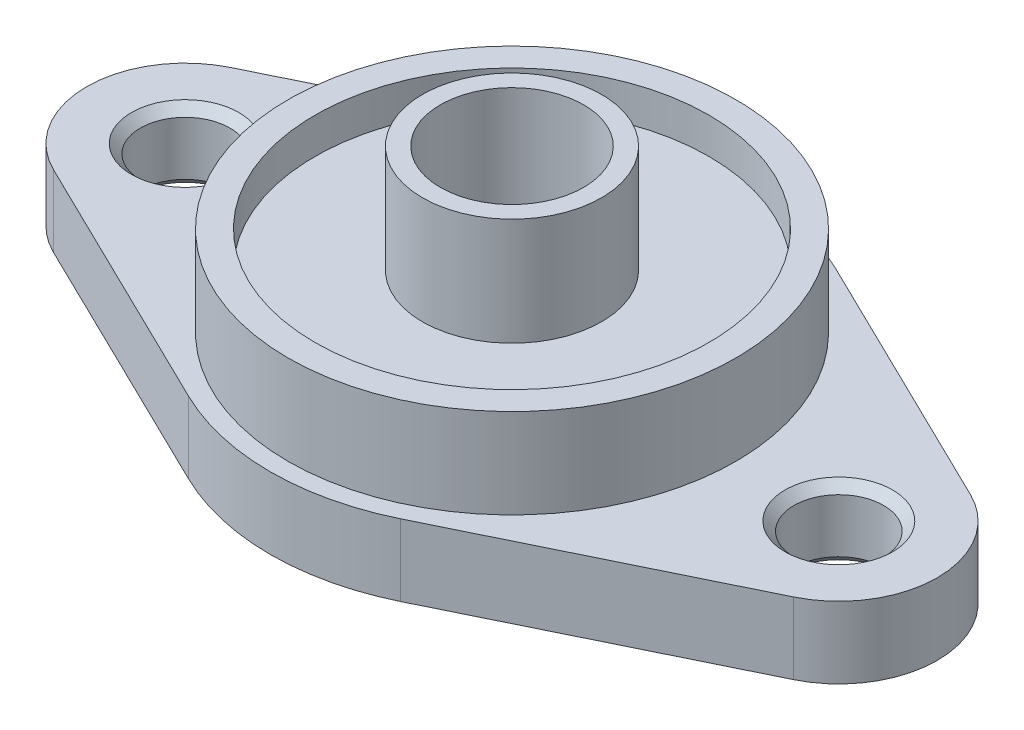
ISO-10303-21;
HEADER;
FILE_DESCRIPTION(('STEP AP214'),'2;1');
FILE_NAME('part.step','',(''),(''),'','','');
FILE_SCHEMA(('AUTOMOTIVE_DESIGN { 1 0 10303 214 1 1 1 1 }'));
ENDSEC;
DATA;
#1=APPLICATION_CONTEXT('core data for automotive mechanical design processes');
#2=APPLICATION_PROTOCOL_DEFINITION('international standard','automotive_design',2000,#1);
#3=PRODUCT_CONTEXT('',#1,'mechanical');
#4=PRODUCT('Part','Part','',(#3));
#5=PRODUCT_RELATED_PRODUCT_CATEGORY('part','',(#4));
#6=PRODUCT_DEFINITION_FORMATION('','',#4);
#7=PRODUCT_DEFINITION_CONTEXT('part definition',#1,'design');
#8=PRODUCT_DEFINITION('design','',#6,#7);
#9=PRODUCT_DEFINITION_SHAPE('','',#8);
#10=(LENGTH_UNIT() NAMED_UNIT(*) SI_UNIT(.MILLI.,.METRE.));
#11=(NAMED_UNIT(*) PLANE_ANGLE_UNIT() SI_UNIT($,.RADIAN.));
#12=(NAMED_UNIT(*) SI_UNIT($,.STERADIAN.) SOLID_ANGLE_UNIT());
#13=UNCERTAINTY_MEASURE_WITH_UNIT(LENGTH_MEASURE(1.E-05),#10,'distance_accuracy_value','');
#14=(GEOMETRIC_REPRESENTATION_CONTEXT(3) GLOBAL_UNCERTAINTY_ASSIGNED_CONTEXT((#13)) GLOBAL_UNIT_ASSIGNED_CONTEXT((#10,
#11,#12)) REPRESENTATION_CONTEXT('',''));
#15=CARTESIAN_POINT('',(0.,0.,0.));
#16=DIRECTION('',(0.,0.,1.));
#17=DIRECTION('',(1.,0.,0.));
#18=AXIS2_PLACEMENT_3D('',#15,#16,#17);
#19=CARTESIAN_POINT('',(0.,4.,0.));
#20=DIRECTION('',(0.,1.,0.));
#21=DIRECTION('',(0.,0.,1.));
#22=AXIS2_PLACEMENT_3D('',#19,#20,#21);
#23=PLANE('',#22);
#24=CARTESIAN_POINT('',(18.25,4.,0.));
#25=DIRECTION('',(0.,1.,0.));
#26=DIRECTION('',(0.,0.,1.));
#27=AXIS2_PLACEMENT_3D('',#24,#25,#26);
#28=CIRCLE('',#27,3.);
#29=CARTESIAN_POINT('',(18.25,4.,3.));
#30=VERTEX_POINT('',#29);
#31=EDGE_CURVE('E181',#30,#30,#28,.F.);
#32=ORIENTED_EDGE('',*,*,#31,.T.);
#33=EDGE_LOOP('',(#32));
#34=FACE_BOUND('',#33,.T.);
#35=CARTESIAN_POINT('',(-18.25,4.,0.));
#36=DIRECTION('',(0.,1.,0.));
#37=DIRECTION('',(0.,0.,1.));
#38=AXIS2_PLACEMENT_3D('',#35,#36,#37);
#39=CIRCLE('',#38,3.);
#40=CARTESIAN_POINT('',(-18.25,4.,3.));
#41=VERTEX_POINT('',#40);
#42=EDGE_CURVE('E178',#41,#41,#39,.F.);
#43=ORIENTED_EDGE('',*,*,#42,.T.);
#44=EDGE_LOOP('',(#43));
#45=FACE_BOUND('',#44,.T.);
#46=CARTESIAN_POINT('',(0.,4.,0.));
#47=DIRECTION('',(0.,1.,0.));
#48=DIRECTION('',(0.,0.,1.));
#49=AXIS2_PLACEMENT_3D('',#46,#47,#48);
#50=CIRCLE('',#49,13.5);
#51=CARTESIAN_POINT('',(5.91780821917808,4.,-12.1338182729522));
#52=VERTEX_POINT('',#51);
#53=CARTESIAN_POINT('',(-5.91780821917808,4.,-12.1338182729522));
#54=VERTEX_POINT('',#53);
#55=EDGE_CURVE('E148',#52,#54,#50,.T.);
#56=ORIENTED_EDGE('',*,*,#55,.T.);
#57=DIRECTION('',(-0.898801353552014,0.,0.438356164383562));
#58=VECTOR('',#57,1.);
#59=CARTESIAN_POINT('',(-5.91780821917808,4.,-12.1338182729522));
#60=LINE('',#59,#58);
#61=CARTESIAN_POINT('',(-20.6609589041096,4.,-4.94340744453608));
#62=VERTEX_POINT('',#61);
#63=EDGE_CURVE('E96',#54,#62,#60,.T.);
#64=ORIENTED_EDGE('',*,*,#63,.T.);
#65=CARTESIAN_POINT('',(-18.25,4.,0.));
#66=DIRECTION('',(0.,1.,0.));
#67=DIRECTION('',(0.,0.,1.));
#68=AXIS2_PLACEMENT_3D('',#65,#66,#67);
#69=CIRCLE('',#68,5.5);
#70=CARTESIAN_POINT('',(-20.6609589041096,4.,4.94340744453608));
#71=VERTEX_POINT('',#70);
#72=EDGE_CURVE('E309',#62,#71,#69,.T.);
#73=ORIENTED_EDGE('',*,*,#72,.T.);
#74=DIRECTION('',(0.898801353552014,0.,0.438356164383561));
#75=VECTOR('',#74,1.);
#76=CARTESIAN_POINT('',(-5.91780821917808,4.,12.1338182729522));
#77=LINE('',#76,#75);
#78=CARTESIAN_POINT('',(-5.91780821917808,4.,12.1338182729522));
#79=VERTEX_POINT('',#78);
#80=EDGE_CURVE('E311',#71,#79,#77,.T.);
#81=ORIENTED_EDGE('',*,*,#80,.T.);
#82=CARTESIAN_POINT('',(0.,4.,0.));
#83=DIRECTION('',(0.,1.,0.));
#84=DIRECTION('',(0.,0.,1.));
#85=AXIS2_PLACEMENT_3D('',#82,#83,#84);
#86=CIRCLE('',#85,13.5);
#87=CARTESIAN_POINT('',(5.91780821917808,4.,12.1338182729522));
#88=VERTEX_POINT('',#87);
#89=EDGE_CURVE('E115',#79,#88,#86,.T.);
#90=ORIENTED_EDGE('',*,*,#89,.T.);
#91=DIRECTION('',(0.898801353552014,0.,-0.438356164383561));
#92=VECTOR('',#91,1.);
#93=CARTESIAN_POINT('',(5.91780821917808,4.,12.1338182729522));
#94=LINE('',#93,#92);
#95=CARTESIAN_POINT('',(20.6609589041096,4.,4.94340744453608));
#96=VERTEX_POINT('',#95);
#97=EDGE_CURVE('E109',#88,#96,#94,.T.);
#98=ORIENTED_EDGE('',*,*,#97,.T.);
#99=CARTESIAN_POINT('',(18.25,4.,0.));
#100=DIRECTION('',(0.,1.,0.));
#101=DIRECTION('',(0.,0.,1.));
#102=AXIS2_PLACEMENT_3D('',#99,#100,#101);
#103=CIRCLE('',#102,5.5);
#104=CARTESIAN_POINT('',(20.6609589041096,4.,-4.94340744453608));
#105=VERTEX_POINT('',#104);
#106=EDGE_CURVE('E113',#96,#105,#103,.T.);
#107=ORIENTED_EDGE('',*,*,#106,.T.);
#108=DIRECTION('',(-0.898801353552014,0.,-0.438356164383561));
#109=VECTOR('',#108,1.);
#110=CARTESIAN_POINT('',(5.91780821917808,4.,-12.1338182729522));
#111=LINE('',#110,#109);
#112=EDGE_CURVE('E52',#105,#52,#111,.T.);
#113=ORIENTED_EDGE('',*,*,#112,.T.);
#114=EDGE_LOOP('',(#56,#64,#73,#81,#90,#98,#107,#113));
#115=FACE_BOUND('',#114,.T.);
#116=CARTESIAN_POINT('',(0.,4.,0.));
#117=DIRECTION('',(0.,1.,0.));
#118=DIRECTION('',(0.,0.,1.));
#119=AXIS2_PLACEMENT_3D('',#116,#117,#118);
#120=CIRCLE('',#119,12.5);
#121=CARTESIAN_POINT('',(0.,4.,12.5));
#122=VERTEX_POINT('',#121);
#123=EDGE_CURVE('E291',#122,#122,#120,.T.);
#124=ORIENTED_EDGE('',*,*,#123,.F.);
#125=EDGE_LOOP('',(#124));
#126=FACE_BOUND('',#125,.T.);
#127=ADVANCED_FACE('F35',(#34,#45,#115,#126),#23,.T.);
#128=CARTESIAN_POINT('',(0.,0.,0.));
#129=DIRECTION('',(0.,1.,0.));
#130=DIRECTION('',(0.,0.,1.));
#131=AXIS2_PLACEMENT_3D('',#128,#129,#130);
#132=PLANE('',#131);
#133=CARTESIAN_POINT('',(18.25,0.,0.));
#134=DIRECTION('',(0.,1.,0.));
#135=DIRECTION('',(0.,0.,1.));
#136=AXIS2_PLACEMENT_3D('',#133,#134,#135);
#137=CIRCLE('',#136,3.00000000000001);
#138=CARTESIAN_POINT('',(18.25,0.,3.));
#139=VERTEX_POINT('',#138);
#140=EDGE_CURVE('E169',#139,#139,#137,.T.);
#141=ORIENTED_EDGE('',*,*,#140,.T.);
#142=EDGE_LOOP('',(#141));
#143=FACE_BOUND('',#142,.T.);
#144=CARTESIAN_POINT('',(-18.25,0.,0.));
#145=DIRECTION('',(0.,1.,0.));
#146=DIRECTION('',(0.,0.,1.));
#147=AXIS2_PLACEMENT_3D('',#144,#145,#146);
#148=CIRCLE('',#147,3.00000000000001);
#149=CARTESIAN_POINT('',(-18.25,0.,3.00000000000001));
#150=VERTEX_POINT('',#149);
#151=EDGE_CURVE('E166',#150,#150,#148,.T.);
#152=ORIENTED_EDGE('',*,*,#151,.T.);
#153=EDGE_LOOP('',(#152));
#154=FACE_BOUND('',#153,.T.);
#155=CARTESIAN_POINT('',(0.,0.,0.));
#156=DIRECTION('',(0.,1.,0.));
#157=DIRECTION('',(0.,0.,1.));
#158=AXIS2_PLACEMENT_3D('',#155,#156,#157);
#159=CIRCLE('',#158,13.5);
#160=CARTESIAN_POINT('',(5.91780821917808,0.,-12.1338182729522));
#161=VERTEX_POINT('',#160);
#162=CARTESIAN_POINT('',(-5.91780821917808,0.,-12.1338182729522));
#163=VERTEX_POINT('',#162);
#164=EDGE_CURVE('E133',#161,#163,#159,.T.);
#165=ORIENTED_EDGE('',*,*,#164,.F.);
#166=DIRECTION('',(-0.898801353552014,0.,-0.438356164383561));
#167=VECTOR('',#166,1.);
#168=CARTESIAN_POINT('',(5.91780821917808,0.,-12.1338182729522));
#169=LINE('',#168,#167);
#170=CARTESIAN_POINT('',(20.6609589041096,0.,-4.94340744453608));
#171=VERTEX_POINT('',#170);
#172=EDGE_CURVE('E87',#171,#161,#169,.T.);
#173=ORIENTED_EDGE('',*,*,#172,.F.);
#174=CARTESIAN_POINT('',(18.25,0.,0.));
#175=DIRECTION('',(0.,1.,0.));
#176=DIRECTION('',(0.,0.,1.));
#177=AXIS2_PLACEMENT_3D('',#174,#175,#176);
#178=CIRCLE('',#177,5.5);
#179=CARTESIAN_POINT('',(20.6609589041096,0.,4.94340744453608));
#180=VERTEX_POINT('',#179);
#181=EDGE_CURVE('E81',#180,#171,#178,.T.);
#182=ORIENTED_EDGE('',*,*,#181,.F.);
#183=DIRECTION('',(0.898801353552014,0.,-0.438356164383561));
#184=VECTOR('',#183,1.);
#185=CARTESIAN_POINT('',(5.91780821917808,0.,12.1338182729522));
#186=LINE('',#185,#184);
#187=CARTESIAN_POINT('',(5.91780821917808,0.,12.1338182729522));
#188=VERTEX_POINT('',#187);
#189=EDGE_CURVE('E123',#188,#180,#186,.T.);
#190=ORIENTED_EDGE('',*,*,#189,.F.);
#191=CARTESIAN_POINT('',(0.,0.,0.));
#192=DIRECTION('',(0.,1.,0.));
#193=DIRECTION('',(0.,0.,1.));
#194=AXIS2_PLACEMENT_3D('',#191,#192,#193);
#195=CIRCLE('',#194,13.5);
#196=CARTESIAN_POINT('',(-5.91780821917808,0.,12.1338182729522));
#197=VERTEX_POINT('',#196);
#198=EDGE_CURVE('E143',#197,#188,#195,.T.);
#199=ORIENTED_EDGE('',*,*,#198,.F.);
#200=DIRECTION('',(0.898801353552014,0.,0.438356164383561));
#201=VECTOR('',#200,1.);
#202=CARTESIAN_POINT('',(-5.91780821917808,0.,12.1338182729522));
#203=LINE('',#202,#201);
#204=CARTESIAN_POINT('',(-20.6609589041096,0.,4.94340744453608));
#205=VERTEX_POINT('',#204);
#206=EDGE_CURVE('E141',#205,#197,#203,.T.);
#207=ORIENTED_EDGE('',*,*,#206,.F.);
#208=CARTESIAN_POINT('',(-18.25,0.,0.));
#209=DIRECTION('',(0.,1.,0.));
#210=DIRECTION('',(0.,0.,1.));
#211=AXIS2_PLACEMENT_3D('',#208,#209,#210);
#212=CIRCLE('',#211,5.5);
#213=CARTESIAN_POINT('',(-20.6609589041096,0.,-4.94340744453608));
#214=VERTEX_POINT('',#213);
#215=EDGE_CURVE('E139',#214,#205,#212,.T.);
#216=ORIENTED_EDGE('',*,*,#215,.F.);
#217=DIRECTION('',(-0.898801353552014,0.,0.438356164383562));
#218=VECTOR('',#217,1.);
#219=CARTESIAN_POINT('',(-5.91780821917808,0.,-12.1338182729522));
#220=LINE('',#219,#218);
#221=EDGE_CURVE('E136',#163,#214,#220,.T.);
#222=ORIENTED_EDGE('',*,*,#221,.F.);
#223=EDGE_LOOP('',(#165,#173,#182,#190,#199,#207,#216,#222));
#224=FACE_BOUND('',#223,.T.);
#225=CARTESIAN_POINT('',(0.,0.,0.));
#226=DIRECTION('',(0.,1.,0.));
#227=DIRECTION('',(0.,0.,1.));
#228=AXIS2_PLACEMENT_3D('',#225,#226,#227);
#229=CIRCLE('',#228,4.);
#230=CARTESIAN_POINT('',(0.,0.,4.));
#231=VERTEX_POINT('',#230);
#232=EDGE_CURVE('E137',#231,#231,#229,.T.);
#233=ORIENTED_EDGE('',*,*,#232,.T.);
#234=EDGE_LOOP('',(#233));
#235=FACE_BOUND('',#234,.T.);
#236=ADVANCED_FACE('F198',(#143,#154,#224,#235),#132,.F.);
#237=CARTESIAN_POINT('',(0.,4.,0.));
#238=DIRECTION('',(0.,-1.,0.));
#239=DIRECTION('',(0.,0.,-1.));
#240=AXIS2_PLACEMENT_3D('',#237,#238,#239);
#241=CYLINDRICAL_SURFACE('',#240,13.5);
#242=ORIENTED_EDGE('',*,*,#164,.T.);
#243=DIRECTION('',(0.,-1.,0.));
#244=VECTOR('',#243,1.);
#245=CARTESIAN_POINT('',(-5.91780821917808,4.,-12.1338182729522));
#246=LINE('',#245,#244);
#247=EDGE_CURVE('E161',#54,#163,#246,.T.);
#248=ORIENTED_EDGE('',*,*,#247,.F.);
#249=ORIENTED_EDGE('',*,*,#55,.F.);
#250=DIRECTION('',(0.,-1.,0.));
#251=VECTOR('',#250,1.);
#252=CARTESIAN_POINT('',(5.91780821917808,4.,-12.1338182729522));
#253=LINE('',#252,#251);
#254=EDGE_CURVE('E129',#52,#161,#253,.T.);
#255=ORIENTED_EDGE('',*,*,#254,.T.);
#256=EDGE_LOOP('',(#242,#248,#249,#255));
#257=FACE_BOUND('',#256,.T.);
#258=ADVANCED_FACE('F204',(#257),#241,.T.);
#259=CARTESIAN_POINT('',(-5.91780821917808,4.,-12.1338182729522));
#260=DIRECTION('',(0.438356164383562,0.,0.898801353552014));
#261=DIRECTION('',(0.898801353552014,0.,-0.438356164383562));
#262=AXIS2_PLACEMENT_3D('',#259,#260,#261);
#263=PLANE('',#262);
#264=ORIENTED_EDGE('',*,*,#221,.T.);
#265=DIRECTION('',(0.,-1.,0.));
#266=VECTOR('',#265,1.);
#267=CARTESIAN_POINT('',(-20.6609589041096,4.,-4.94340744453608));
#268=LINE('',#267,#266);
#269=EDGE_CURVE('E158',#62,#214,#268,.T.);
#270=ORIENTED_EDGE('',*,*,#269,.F.);
#271=ORIENTED_EDGE('',*,*,#63,.F.);
#272=ORIENTED_EDGE('',*,*,#247,.T.);
#273=EDGE_LOOP('',(#264,#270,#271,#272));
#274=FACE_BOUND('',#273,.T.);
#275=ADVANCED_FACE('F230',(#274),#263,.F.);
#276=CARTESIAN_POINT('',(-18.25,4.,0.));
#277=DIRECTION('',(0.,-1.,0.));
#278=DIRECTION('',(0.,0.,-1.));
#279=AXIS2_PLACEMENT_3D('',#276,#277,#278);
#280=CYLINDRICAL_SURFACE('',#279,5.5);
#281=ORIENTED_EDGE('',*,*,#215,.T.);
#282=DIRECTION('',(0.,-1.,0.));
#283=VECTOR('',#282,1.);
#284=CARTESIAN_POINT('',(-20.6609589041096,4.,4.94340744453608));
#285=LINE('',#284,#283);
#286=EDGE_CURVE('E155',#71,#205,#285,.T.);
#287=ORIENTED_EDGE('',*,*,#286,.F.);
#288=ORIENTED_EDGE('',*,*,#72,.F.);
#289=ORIENTED_EDGE('',*,*,#269,.T.);
#290=EDGE_LOOP('',(#281,#287,#288,#289));
#291=FACE_BOUND('',#290,.T.);
#292=ADVANCED_FACE('F226',(#291),#280,.T.);
#293=CARTESIAN_POINT('',(-5.91780821917808,4.,12.1338182729522));
#294=DIRECTION('',(0.438356164383561,0.,-0.898801353552014));
#295=DIRECTION('',(-0.898801353552014,0.,-0.438356164383561));
#296=AXIS2_PLACEMENT_3D('',#293,#294,#295);
#297=PLANE('',#296);
#298=ORIENTED_EDGE('',*,*,#206,.T.);
#299=DIRECTION('',(0.,-1.,0.));
#300=VECTOR('',#299,1.);
#301=CARTESIAN_POINT('',(-5.91780821917808,4.,12.1338182729522));
#302=LINE('',#301,#300);
#303=EDGE_CURVE('E152',#79,#197,#302,.T.);
#304=ORIENTED_EDGE('',*,*,#303,.F.);
#305=ORIENTED_EDGE('',*,*,#80,.F.);
#306=ORIENTED_EDGE('',*,*,#286,.T.);
#307=EDGE_LOOP('',(#298,#304,#305,#306));
#308=FACE_BOUND('',#307,.T.);
#309=ADVANCED_FACE('F222',(#308),#297,.F.);
#310=CARTESIAN_POINT('',(0.,4.,0.));
#311=DIRECTION('',(0.,-1.,0.));
#312=DIRECTION('',(0.,0.,-1.));
#313=AXIS2_PLACEMENT_3D('',#310,#311,#312);
#314=CYLINDRICAL_SURFACE('',#313,13.5);
#315=ORIENTED_EDGE('',*,*,#198,.T.);
#316=DIRECTION('',(0.,-1.,0.));
#317=VECTOR('',#316,1.);
#318=CARTESIAN_POINT('',(5.91780821917808,4.,12.1338182729522));
#319=LINE('',#318,#317);
#320=EDGE_CURVE('E124',#88,#188,#319,.T.);
#321=ORIENTED_EDGE('',*,*,#320,.F.);
#322=ORIENTED_EDGE('',*,*,#89,.F.);
#323=ORIENTED_EDGE('',*,*,#303,.T.);
#324=EDGE_LOOP('',(#315,#321,#322,#323));
#325=FACE_BOUND('',#324,.T.);
#326=ADVANCED_FACE('F219',(#325),#314,.T.);
#327=CARTESIAN_POINT('',(5.91780821917808,4.,12.1338182729522));
#328=DIRECTION('',(-0.438356164383561,0.,-0.898801353552014));
#329=DIRECTION('',(-0.898801353552014,0.,0.438356164383561));
#330=AXIS2_PLACEMENT_3D('',#327,#328,#329);
#331=PLANE('',#330);
#332=ORIENTED_EDGE('',*,*,#189,.T.);
#333=DIRECTION('',(0.,-1.,0.));
#334=VECTOR('',#333,1.);
#335=CARTESIAN_POINT('',(20.6609589041096,4.,4.94340744453608));
#336=LINE('',#335,#334);
#337=EDGE_CURVE('E120',#96,#180,#336,.T.);
#338=ORIENTED_EDGE('',*,*,#337,.F.);
#339=ORIENTED_EDGE('',*,*,#97,.F.);
#340=ORIENTED_EDGE('',*,*,#320,.T.);
#341=EDGE_LOOP('',(#332,#338,#339,#340));
#342=FACE_BOUND('',#341,.T.);
#343=ADVANCED_FACE('F121',(#342),#331,.F.);
#344=CARTESIAN_POINT('',(18.25,4.,0.));
#345=DIRECTION('',(0.,-1.,0.));
#346=DIRECTION('',(0.,0.,-1.));
#347=AXIS2_PLACEMENT_3D('',#344,#345,#346);
#348=CYLINDRICAL_SURFACE('',#347,5.5);
#349=ORIENTED_EDGE('',*,*,#181,.T.);
#350=DIRECTION('',(0.,-1.,0.));
#351=VECTOR('',#350,1.);
#352=CARTESIAN_POINT('',(20.6609589041096,4.,-4.94340744453608));
#353=LINE('',#352,#351);
#354=EDGE_CURVE('E125',#105,#171,#353,.T.);
#355=ORIENTED_EDGE('',*,*,#354,.F.);
#356=ORIENTED_EDGE('',*,*,#106,.F.);
#357=ORIENTED_EDGE('',*,*,#337,.T.);
#358=EDGE_LOOP('',(#349,#355,#356,#357));
#359=FACE_BOUND('',#358,.T.);
#360=ADVANCED_FACE('F127',(#359),#348,.T.);
#361=CARTESIAN_POINT('',(5.91780821917808,4.,-12.1338182729522));
#362=DIRECTION('',(-0.438356164383561,0.,0.898801353552014));
#363=DIRECTION('',(0.898801353552014,0.,0.438356164383561));
#364=AXIS2_PLACEMENT_3D('',#361,#362,#363);
#365=PLANE('',#364);
#366=ORIENTED_EDGE('',*,*,#172,.T.);
#367=ORIENTED_EDGE('',*,*,#254,.F.);
#368=ORIENTED_EDGE('',*,*,#112,.F.);
#369=ORIENTED_EDGE('',*,*,#354,.T.);
#370=EDGE_LOOP('',(#366,#367,#368,#369));
#371=FACE_BOUND('',#370,.T.);
#372=ADVANCED_FACE('F212',(#371),#365,.F.);
#373=CARTESIAN_POINT('',(0.,4.,0.));
#374=DIRECTION('',(0.,-1.,0.));
#375=DIRECTION('',(0.,0.,-1.));
#376=AXIS2_PLACEMENT_3D('',#373,#374,#375);
#377=CYLINDRICAL_SURFACE('',#376,4.);
#378=ORIENTED_EDGE('',*,*,#232,.F.);
#379=EDGE_LOOP('',(#378));
#380=FACE_BOUND('',#379,.T.);
#381=CARTESIAN_POINT('',(0.,13.,0.));
#382=DIRECTION('',(0.,1.,0.));
#383=DIRECTION('',(0.,0.,1.));
#384=AXIS2_PLACEMENT_3D('',#381,#382,#383);
#385=CIRCLE('',#384,4.);
#386=CARTESIAN_POINT('',(0.,13.,4.));
#387=VERTEX_POINT('',#386);
#388=EDGE_CURVE('E297',#387,#387,#385,.T.);
#389=ORIENTED_EDGE('',*,*,#388,.T.);
#390=EDGE_LOOP('',(#389));
#391=FACE_BOUND('',#390,.T.);
#392=ADVANCED_FACE('F209',(#380,#391),#377,.F.);
#393=CARTESIAN_POINT('',(-18.25,4.,0.));
#394=DIRECTION('',(0.,-1.,0.));
#395=DIRECTION('',(0.,0.,-1.));
#396=AXIS2_PLACEMENT_3D('',#393,#394,#395);
#397=CYLINDRICAL_SURFACE('',#396,2.5);
#398=CARTESIAN_POINT('',(-18.25,0.500000000000009,0.));
#399=DIRECTION('',(0.,1.,0.));
#400=DIRECTION('',(0.,0.,1.));
#401=AXIS2_PLACEMENT_3D('',#398,#399,#400);
#402=CIRCLE('',#401,2.5);
#403=CARTESIAN_POINT('',(-18.25,0.500000000000009,2.5));
#404=VERTEX_POINT('',#403);
#405=EDGE_CURVE('E11',#404,#404,#402,.F.);
#406=ORIENTED_EDGE('',*,*,#405,.T.);
#407=EDGE_LOOP('',(#406));
#408=FACE_BOUND('',#407,.T.);
#409=CARTESIAN_POINT('',(-18.25,3.49999999999999,0.));
#410=DIRECTION('',(0.,1.,0.));
#411=DIRECTION('',(0.,0.,1.));
#412=AXIS2_PLACEMENT_3D('',#409,#410,#411);
#413=CIRCLE('',#412,2.5);
#414=CARTESIAN_POINT('',(-18.25,3.49999999999999,2.5));
#415=VERTEX_POINT('',#414);
#416=EDGE_CURVE('E44',#415,#415,#413,.T.);
#417=ORIENTED_EDGE('',*,*,#416,.T.);
#418=EDGE_LOOP('',(#417));
#419=FACE_BOUND('',#418,.T.);
#420=ADVANCED_FACE('F186',(#408,#419),#397,.F.);
#421=CARTESIAN_POINT('',(18.25,4.,0.));
#422=DIRECTION('',(0.,-1.,0.));
#423=DIRECTION('',(0.,0.,-1.));
#424=AXIS2_PLACEMENT_3D('',#421,#422,#423);
#425=CYLINDRICAL_SURFACE('',#424,2.5);
#426=CARTESIAN_POINT('',(18.25,0.500000000000009,0.));
#427=DIRECTION('',(0.,1.,0.));
#428=DIRECTION('',(0.,0.,1.));
#429=AXIS2_PLACEMENT_3D('',#426,#427,#428);
#430=CIRCLE('',#429,2.5);
#431=CARTESIAN_POINT('',(18.25,0.500000000000009,2.49999999999999));
#432=VERTEX_POINT('',#431);
#433=EDGE_CURVE('E175',#432,#432,#430,.F.);
#434=ORIENTED_EDGE('',*,*,#433,.T.);
#435=EDGE_LOOP('',(#434));
#436=FACE_BOUND('',#435,.T.);
#437=CARTESIAN_POINT('',(18.25,3.49999999999999,0.));
#438=DIRECTION('',(0.,1.,0.));
#439=DIRECTION('',(0.,0.,1.));
#440=AXIS2_PLACEMENT_3D('',#437,#438,#439);
#441=CIRCLE('',#440,2.5);
#442=CARTESIAN_POINT('',(18.25,3.49999999999999,2.49999999999999));
#443=VERTEX_POINT('',#442);
#444=EDGE_CURVE('E172',#443,#443,#441,.T.);
#445=ORIENTED_EDGE('',*,*,#444,.T.);
#446=EDGE_LOOP('',(#445));
#447=FACE_BOUND('',#446,.T.);
#448=ADVANCED_FACE('F250',(#436,#447),#425,.F.);
#449=CARTESIAN_POINT('',(0.,13.,0.));
#450=DIRECTION('',(0.,1.,0.));
#451=DIRECTION('',(0.,0.,1.));
#452=AXIS2_PLACEMENT_3D('',#449,#450,#451);
#453=PLANE('',#452);
#454=CARTESIAN_POINT('',(0.,13.,0.));
#455=DIRECTION('',(0.,1.,0.));
#456=DIRECTION('',(0.,0.,1.));
#457=AXIS2_PLACEMENT_3D('',#454,#455,#456);
#458=CIRCLE('',#457,5.);
#459=CARTESIAN_POINT('',(0.,13.,5.));
#460=VERTEX_POINT('',#459);
#461=EDGE_CURVE('E302',#460,#460,#458,.T.);
#462=ORIENTED_EDGE('',*,*,#461,.T.);
#463=EDGE_LOOP('',(#462));
#464=FACE_BOUND('',#463,.T.);
#465=ORIENTED_EDGE('',*,*,#388,.F.);
#466=EDGE_LOOP('',(#465));
#467=FACE_BOUND('',#466,.T.);
#468=ADVANCED_FACE('F252',(#464,#467),#453,.T.);
#469=CARTESIAN_POINT('',(0.,13.,0.));
#470=DIRECTION('',(0.,-1.,0.));
#471=DIRECTION('',(0.,0.,-1.));
#472=AXIS2_PLACEMENT_3D('',#469,#470,#471);
#473=CYLINDRICAL_SURFACE('',#472,5.);
#474=CARTESIAN_POINT('',(0.,7.,0.));
#475=DIRECTION('',(0.,1.,0.));
#476=DIRECTION('',(0.,0.,1.));
#477=AXIS2_PLACEMENT_3D('',#474,#475,#476);
#478=CIRCLE('',#477,5.);
#479=CARTESIAN_POINT('',(0.,7.,5.));
#480=VERTEX_POINT('',#479);
#481=EDGE_CURVE('E287',#480,#480,#478,.T.);
#482=ORIENTED_EDGE('',*,*,#481,.T.);
#483=EDGE_LOOP('',(#482));
#484=FACE_BOUND('',#483,.T.);
#485=ORIENTED_EDGE('',*,*,#461,.F.);
#486=EDGE_LOOP('',(#485));
#487=FACE_BOUND('',#486,.T.);
#488=ADVANCED_FACE('F259',(#484,#487),#473,.T.);
#489=CARTESIAN_POINT('',(0.,9.,0.));
#490=DIRECTION('',(0.,1.,0.));
#491=DIRECTION('',(0.,0.,1.));
#492=AXIS2_PLACEMENT_3D('',#489,#490,#491);
#493=PLANE('',#492);
#494=CARTESIAN_POINT('',(0.,9.,0.));
#495=DIRECTION('',(0.,1.,0.));
#496=DIRECTION('',(0.,0.,1.));
#497=AXIS2_PLACEMENT_3D('',#494,#495,#496);
#498=CIRCLE('',#497,12.5);
#499=CARTESIAN_POINT('',(0.,9.,12.5));
#500=VERTEX_POINT('',#499);
#501=EDGE_CURVE('E294',#500,#500,#498,.T.);
#502=ORIENTED_EDGE('',*,*,#501,.T.);
#503=EDGE_LOOP('',(#502));
#504=FACE_BOUND('',#503,.T.);
#505=CARTESIAN_POINT('',(0.,9.,0.));
#506=DIRECTION('',(0.,1.,0.));
#507=DIRECTION('',(0.,0.,1.));
#508=AXIS2_PLACEMENT_3D('',#505,#506,#507);
#509=CIRCLE('',#508,11.);
#510=CARTESIAN_POINT('',(0.,9.,11.));
#511=VERTEX_POINT('',#510);
#512=EDGE_CURVE('E288',#511,#511,#509,.T.);
#513=ORIENTED_EDGE('',*,*,#512,.F.);
#514=EDGE_LOOP('',(#513));
#515=FACE_BOUND('',#514,.T.);
#516=ADVANCED_FACE('F265',(#504,#515),#493,.T.);
#517=CARTESIAN_POINT('',(0.,9.,0.));
#518=DIRECTION('',(0.,-1.,0.));
#519=DIRECTION('',(0.,0.,-1.));
#520=AXIS2_PLACEMENT_3D('',#517,#518,#519);
#521=CYLINDRICAL_SURFACE('',#520,12.5);
#522=ORIENTED_EDGE('',*,*,#501,.F.);
#523=EDGE_LOOP('',(#522));
#524=FACE_BOUND('',#523,.T.);
#525=ORIENTED_EDGE('',*,*,#123,.T.);
#526=EDGE_LOOP('',(#525));
#527=FACE_BOUND('',#526,.T.);
#528=ADVANCED_FACE('F268',(#524,#527),#521,.T.);
#529=CARTESIAN_POINT('',(0.,9.,0.));
#530=DIRECTION('',(0.,-1.,0.));
#531=DIRECTION('',(0.,0.,-1.));
#532=AXIS2_PLACEMENT_3D('',#529,#530,#531);
#533=CYLINDRICAL_SURFACE('',#532,11.);
#534=CARTESIAN_POINT('',(0.,7.,0.));
#535=DIRECTION('',(0.,1.,0.));
#536=DIRECTION('',(0.,0.,1.));
#537=AXIS2_PLACEMENT_3D('',#534,#535,#536);
#538=CIRCLE('',#537,11.);
#539=CARTESIAN_POINT('',(0.,7.,11.));
#540=VERTEX_POINT('',#539);
#541=EDGE_CURVE('E163',#540,#540,#538,.T.);
#542=ORIENTED_EDGE('',*,*,#541,.F.);
#543=EDGE_LOOP('',(#542));
#544=FACE_BOUND('',#543,.T.);
#545=ORIENTED_EDGE('',*,*,#512,.T.);
#546=EDGE_LOOP('',(#545));
#547=FACE_BOUND('',#546,.T.);
#548=ADVANCED_FACE('F271',(#544,#547),#533,.F.);
#549=CARTESIAN_POINT('',(0.,7.,0.));
#550=DIRECTION('',(0.,1.,0.));
#551=DIRECTION('',(0.,0.,1.));
#552=AXIS2_PLACEMENT_3D('',#549,#550,#551);
#553=PLANE('',#552);
#554=ORIENTED_EDGE('',*,*,#541,.T.);
#555=EDGE_LOOP('',(#554));
#556=FACE_BOUND('',#555,.T.);
#557=ORIENTED_EDGE('',*,*,#481,.F.);
#558=EDGE_LOOP('',(#557));
#559=FACE_BOUND('',#558,.T.);
#560=ADVANCED_FACE('F240',(#556,#559),#553,.T.);
#561=CARTESIAN_POINT('',(18.25,0.,0.));
#562=DIRECTION('',(0.,-1.,0.));
#563=DIRECTION('',(0.,0.,-1.));
#564=AXIS2_PLACEMENT_3D('',#561,#562,#563);
#565=CONICAL_SURFACE('',#564,3.00000000000001,0.78539816339745);
#566=ORIENTED_EDGE('',*,*,#433,.F.);
#567=EDGE_LOOP('',(#566));
#568=FACE_BOUND('',#567,.T.);
#569=ORIENTED_EDGE('',*,*,#140,.F.);
#570=EDGE_LOOP('',(#569));
#571=FACE_BOUND('',#570,.T.);
#572=ADVANCED_FACE('F237',(#568,#571),#565,.F.);
#573=CARTESIAN_POINT('',(18.25,3.49999999999999,0.));
#574=DIRECTION('',(0.,1.,0.));
#575=DIRECTION('',(0.,0.,1.));
#576=AXIS2_PLACEMENT_3D('',#573,#574,#575);
#577=CONICAL_SURFACE('',#576,2.5,0.785398163397447);
#578=ORIENTED_EDGE('',*,*,#31,.F.);
#579=EDGE_LOOP('',(#578));
#580=FACE_BOUND('',#579,.T.);
#581=ORIENTED_EDGE('',*,*,#444,.F.);
#582=EDGE_LOOP('',(#581));
#583=FACE_BOUND('',#582,.T.);
#584=ADVANCED_FACE('F194',(#580,#583),#577,.F.);
#585=CARTESIAN_POINT('',(-18.25,0.,0.));
#586=DIRECTION('',(0.,-1.,0.));
#587=DIRECTION('',(0.,0.,-1.));
#588=AXIS2_PLACEMENT_3D('',#585,#586,#587);
#589=CONICAL_SURFACE('',#588,3.00000000000001,0.78539816339745);
#590=ORIENTED_EDGE('',*,*,#405,.F.);
#591=EDGE_LOOP('',(#590));
#592=FACE_BOUND('',#591,.T.);
#593=ORIENTED_EDGE('',*,*,#151,.F.);
#594=EDGE_LOOP('',(#593));
#595=FACE_BOUND('',#594,.T.);
#596=ADVANCED_FACE('F189',(#592,#595),#589,.F.);
#597=CARTESIAN_POINT('',(-18.25,3.49999999999999,0.));
#598=DIRECTION('',(0.,1.,0.));
#599=DIRECTION('',(0.,0.,1.));
#600=AXIS2_PLACEMENT_3D('',#597,#598,#599);
#601=CONICAL_SURFACE('',#600,2.5,0.785398163397447);
#602=ORIENTED_EDGE('',*,*,#42,.F.);
#603=EDGE_LOOP('',(#602));
#604=FACE_BOUND('',#603,.T.);
#605=ORIENTED_EDGE('',*,*,#416,.F.);
#606=EDGE_LOOP('',(#605));
#607=FACE_BOUND('',#606,.T.);
#608=ADVANCED_FACE('F37',(#604,#607),#601,.F.);
#609=CLOSED_SHELL('',(#127,#236,#258,#275,#292,#309,#326,#343,#360,#372,#392,#420,#448,#468,
#488,#516,#528,#548,#560,#572,#584,#596,#608));
#610=MANIFOLD_SOLID_BREP('B2',#609);
#611=ADVANCED_BREP_SHAPE_REPRESENTATION('',(#18,#610),#14);
#612=SHAPE_DEFINITION_REPRESENTATION(#9,#611);
ENDSEC;
END-ISO-10303-21;
